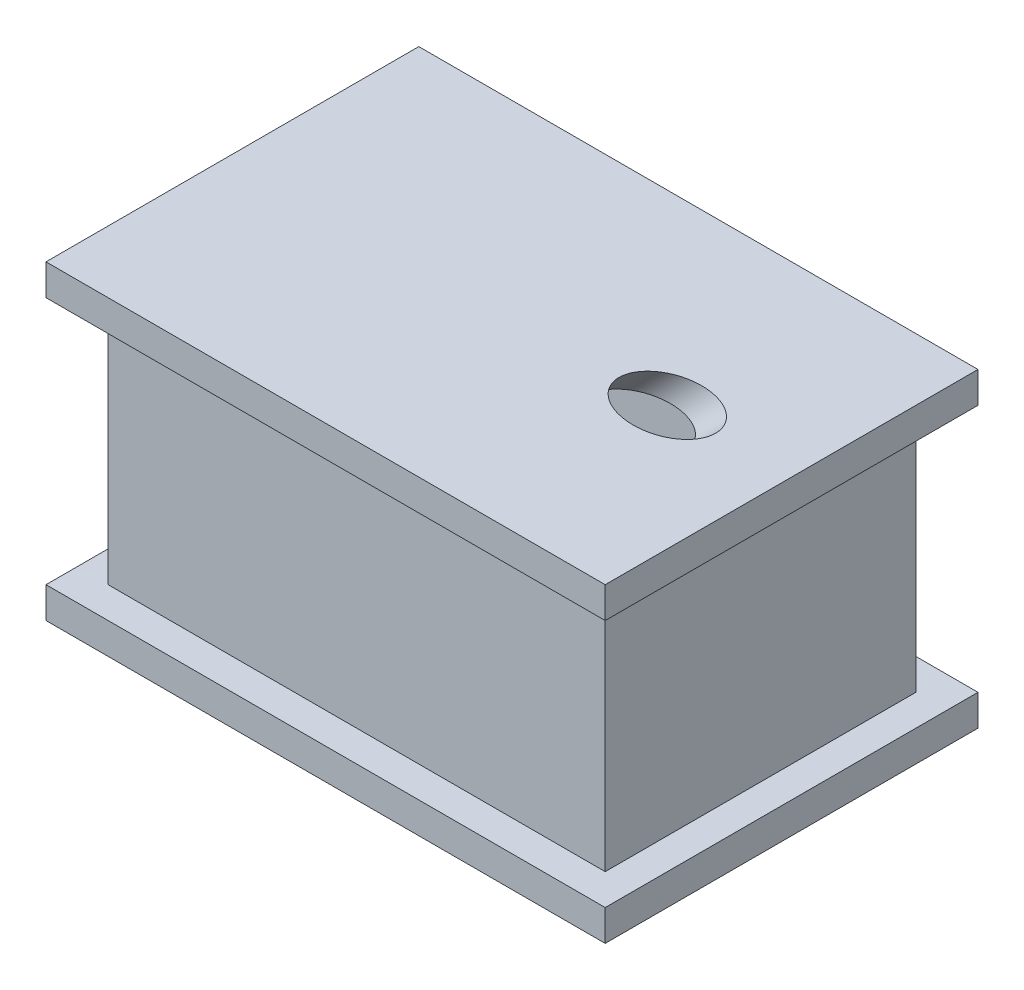
ISO-10303-21;
HEADER;
FILE_DESCRIPTION(('STEP AP214'),'2;1');
FILE_NAME('part.step','',(''),(''),'','','');
FILE_SCHEMA(('AUTOMOTIVE_DESIGN { 1 0 10303 214 1 1 1 1 }'));
ENDSEC;
DATA;
#1=APPLICATION_CONTEXT('core data for automotive mechanical design processes');
#2=APPLICATION_PROTOCOL_DEFINITION('international standard','automotive_design',2000,#1);
#3=PRODUCT_CONTEXT('',#1,'mechanical');
#4=PRODUCT('Part','Part','',(#3));
#5=PRODUCT_RELATED_PRODUCT_CATEGORY('part','',(#4));
#6=PRODUCT_DEFINITION_FORMATION('','',#4);
#7=PRODUCT_DEFINITION_CONTEXT('part definition',#1,'design');
#8=PRODUCT_DEFINITION('design','',#6,#7);
#9=PRODUCT_DEFINITION_SHAPE('','',#8);
#10=(LENGTH_UNIT() NAMED_UNIT(*) SI_UNIT(.MILLI.,.METRE.));
#11=(NAMED_UNIT(*) PLANE_ANGLE_UNIT() SI_UNIT($,.RADIAN.));
#12=(NAMED_UNIT(*) SI_UNIT($,.STERADIAN.) SOLID_ANGLE_UNIT());
#13=UNCERTAINTY_MEASURE_WITH_UNIT(LENGTH_MEASURE(1.E-05),#10,'distance_accuracy_value','');
#14=(GEOMETRIC_REPRESENTATION_CONTEXT(3) GLOBAL_UNCERTAINTY_ASSIGNED_CONTEXT((#13)) GLOBAL_UNIT_ASSIGNED_CONTEXT((#10,
#11,#12)) REPRESENTATION_CONTEXT('',''));
#15=CARTESIAN_POINT('',(0.,0.,0.));
#16=DIRECTION('',(0.,0.,1.));
#17=DIRECTION('',(1.,0.,0.));
#18=AXIS2_PLACEMENT_3D('',#15,#16,#17);
#19=CARTESIAN_POINT('',(-2000.,1000.,-1250.));
#20=DIRECTION('',(0.,0.,1.));
#21=DIRECTION('',(1.,0.,0.));
#22=AXIS2_PLACEMENT_3D('',#19,#20,#21);
#23=PLANE('',#22);
#24=DIRECTION('',(-1.,0.,0.));
#25=VECTOR('',#24,1.);
#26=CARTESIAN_POINT('',(-2000.,-1000.,-1250.));
#27=LINE('',#26,#25);
#28=CARTESIAN_POINT('',(2000.,-1000.,-1250.));
#29=VERTEX_POINT('',#28);
#30=CARTESIAN_POINT('',(-2000.,-1000.,-1250.));
#31=VERTEX_POINT('',#30);
#32=EDGE_CURVE('E266',#29,#31,#27,.T.);
#33=ORIENTED_EDGE('',*,*,#32,.T.);
#34=DIRECTION('',(0.,-1.,0.));
#35=VECTOR('',#34,1.);
#36=CARTESIAN_POINT('',(-2000.,1000.,-1250.));
#37=LINE('',#36,#35);
#38=CARTESIAN_POINT('',(-2000.,1000.,-1250.));
#39=VERTEX_POINT('',#38);
#40=EDGE_CURVE('E11',#39,#31,#37,.T.);
#41=ORIENTED_EDGE('',*,*,#40,.F.);
#42=DIRECTION('',(-1.,0.,0.));
#43=VECTOR('',#42,1.);
#44=CARTESIAN_POINT('',(-2000.,1000.,-1250.));
#45=LINE('',#44,#43);
#46=CARTESIAN_POINT('',(2000.,1000.,-1250.));
#47=VERTEX_POINT('',#46);
#48=EDGE_CURVE('E98',#47,#39,#45,.T.);
#49=ORIENTED_EDGE('',*,*,#48,.F.);
#50=DIRECTION('',(0.,-1.,0.));
#51=VECTOR('',#50,1.);
#52=CARTESIAN_POINT('',(2000.,1000.,-1250.));
#53=LINE('',#52,#51);
#54=EDGE_CURVE('E278',#47,#29,#53,.T.);
#55=ORIENTED_EDGE('',*,*,#54,.T.);
#56=EDGE_LOOP('',(#33,#41,#49,#55));
#57=FACE_BOUND('',#56,.T.);
#58=ADVANCED_FACE('F32',(#57),#23,.F.);
#59=CARTESIAN_POINT('',(-2000.,1000.,-1250.));
#60=DIRECTION('',(1.,0.,0.));
#61=DIRECTION('',(0.,0.,-1.));
#62=AXIS2_PLACEMENT_3D('',#59,#60,#61);
#63=PLANE('',#62);
#64=DIRECTION('',(0.,0.,1.));
#65=VECTOR('',#64,1.);
#66=CARTESIAN_POINT('',(-2000.,-1000.,-1250.));
#67=LINE('',#66,#65);
#68=CARTESIAN_POINT('',(-2000.,-1000.,1250.));
#69=VERTEX_POINT('',#68);
#70=EDGE_CURVE('E281',#31,#69,#67,.T.);
#71=ORIENTED_EDGE('',*,*,#70,.T.);
#72=DIRECTION('',(0.,-1.,0.));
#73=VECTOR('',#72,1.);
#74=CARTESIAN_POINT('',(-2000.,1000.,1250.));
#75=LINE('',#74,#73);
#76=CARTESIAN_POINT('',(-2000.,1000.,1250.));
#77=VERTEX_POINT('',#76);
#78=EDGE_CURVE('E40',#77,#69,#75,.T.);
#79=ORIENTED_EDGE('',*,*,#78,.F.);
#80=DIRECTION('',(0.,0.,1.));
#81=VECTOR('',#80,1.);
#82=CARTESIAN_POINT('',(-2000.,1000.,-1250.));
#83=LINE('',#82,#81);
#84=EDGE_CURVE('E268',#39,#77,#83,.T.);
#85=ORIENTED_EDGE('',*,*,#84,.F.);
#86=ORIENTED_EDGE('',*,*,#40,.T.);
#87=EDGE_LOOP('',(#71,#79,#85,#86));
#88=FACE_BOUND('',#87,.T.);
#89=ADVANCED_FACE('F291',(#88),#63,.F.);
#90=CARTESIAN_POINT('',(-2000.,1000.,1250.));
#91=DIRECTION('',(0.,0.,-1.));
#92=DIRECTION('',(-1.,0.,0.));
#93=AXIS2_PLACEMENT_3D('',#90,#91,#92);
#94=PLANE('',#93);
#95=DIRECTION('',(1.,0.,0.));
#96=VECTOR('',#95,1.);
#97=CARTESIAN_POINT('',(-2000.,-1000.,1250.));
#98=LINE('',#97,#96);
#99=CARTESIAN_POINT('',(2000.,-1000.,1250.));
#100=VERTEX_POINT('',#99);
#101=EDGE_CURVE('E68',#69,#100,#98,.T.);
#102=ORIENTED_EDGE('',*,*,#101,.T.);
#103=DIRECTION('',(0.,-1.,0.));
#104=VECTOR('',#103,1.);
#105=CARTESIAN_POINT('',(2000.,1000.,1250.));
#106=LINE('',#105,#104);
#107=CARTESIAN_POINT('',(2000.,1000.,1250.));
#108=VERTEX_POINT('',#107);
#109=EDGE_CURVE('E56',#108,#100,#106,.T.);
#110=ORIENTED_EDGE('',*,*,#109,.F.);
#111=DIRECTION('',(1.,0.,0.));
#112=VECTOR('',#111,1.);
#113=CARTESIAN_POINT('',(-2000.,1000.,1250.));
#114=LINE('',#113,#112);
#115=EDGE_CURVE('E272',#77,#108,#114,.T.);
#116=ORIENTED_EDGE('',*,*,#115,.F.);
#117=ORIENTED_EDGE('',*,*,#78,.T.);
#118=EDGE_LOOP('',(#102,#110,#116,#117));
#119=FACE_BOUND('',#118,.T.);
#120=ADVANCED_FACE('F289',(#119),#94,.F.);
#121=CARTESIAN_POINT('',(2000.,1000.,-1250.));
#122=DIRECTION('',(-1.,0.,0.));
#123=DIRECTION('',(0.,0.,1.));
#124=AXIS2_PLACEMENT_3D('',#121,#122,#123);
#125=PLANE('',#124);
#126=DIRECTION('',(0.,0.,-1.));
#127=VECTOR('',#126,1.);
#128=CARTESIAN_POINT('',(2000.,-1000.,-1250.));
#129=LINE('',#128,#127);
#130=EDGE_CURVE('E269',#100,#29,#129,.T.);
#131=ORIENTED_EDGE('',*,*,#130,.T.);
#132=ORIENTED_EDGE('',*,*,#54,.F.);
#133=DIRECTION('',(0.,0.,-1.));
#134=VECTOR('',#133,1.);
#135=CARTESIAN_POINT('',(2000.,1000.,-1250.));
#136=LINE('',#135,#134);
#137=EDGE_CURVE('E275',#108,#47,#136,.T.);
#138=ORIENTED_EDGE('',*,*,#137,.F.);
#139=ORIENTED_EDGE('',*,*,#109,.T.);
#140=EDGE_LOOP('',(#131,#132,#138,#139));
#141=FACE_BOUND('',#140,.T.);
#142=ADVANCED_FACE('F295',(#141),#125,.F.);
#143=CARTESIAN_POINT('',(0.,1000.,0.));
#144=DIRECTION('',(0.,1.,0.));
#145=DIRECTION('',(0.,0.,1.));
#146=AXIS2_PLACEMENT_3D('',#143,#144,#145);
#147=PLANE('',#146);
#148=DIRECTION('',(0.,0.,-1.));
#149=VECTOR('',#148,1.);
#150=CARTESIAN_POINT('',(2250.,1000.,1500.));
#151=LINE('',#150,#149);
#152=CARTESIAN_POINT('',(2250.,1000.,1500.));
#153=VERTEX_POINT('',#152);
#154=CARTESIAN_POINT('',(2250.,1000.,-1500.));
#155=VERTEX_POINT('',#154);
#156=EDGE_CURVE('E180',#153,#155,#151,.T.);
#157=ORIENTED_EDGE('',*,*,#156,.F.);
#158=DIRECTION('',(1.,0.,0.));
#159=VECTOR('',#158,1.);
#160=CARTESIAN_POINT('',(-2250.,1000.,1500.));
#161=LINE('',#160,#159);
#162=CARTESIAN_POINT('',(-2250.,1000.,1500.));
#163=VERTEX_POINT('',#162);
#164=EDGE_CURVE('E218',#163,#153,#161,.T.);
#165=ORIENTED_EDGE('',*,*,#164,.F.);
#166=DIRECTION('',(0.,0.,1.));
#167=VECTOR('',#166,1.);
#168=CARTESIAN_POINT('',(-2250.,1000.,-1500.));
#169=LINE('',#168,#167);
#170=CARTESIAN_POINT('',(-2250.,1000.,-1500.));
#171=VERTEX_POINT('',#170);
#172=EDGE_CURVE('E229',#171,#163,#169,.T.);
#173=ORIENTED_EDGE('',*,*,#172,.F.);
#174=DIRECTION('',(-1.,0.,0.));
#175=VECTOR('',#174,1.);
#176=CARTESIAN_POINT('',(2250.,1000.,-1500.));
#177=LINE('',#176,#175);
#178=EDGE_CURVE('E227',#155,#171,#177,.T.);
#179=ORIENTED_EDGE('',*,*,#178,.F.);
#180=EDGE_LOOP('',(#157,#165,#173,#179));
#181=FACE_BOUND('',#180,.T.);
#182=ORIENTED_EDGE('',*,*,#137,.T.);
#183=ORIENTED_EDGE('',*,*,#48,.T.);
#184=ORIENTED_EDGE('',*,*,#84,.T.);
#185=ORIENTED_EDGE('',*,*,#115,.T.);
#186=EDGE_LOOP('',(#182,#183,#184,#185));
#187=FACE_BOUND('',#186,.T.);
#188=ADVANCED_FACE('F307',(#181,#187),#147,.F.);
#189=CARTESIAN_POINT('',(2250.,1250.,1500.));
#190=DIRECTION('',(-1.,0.,0.));
#191=DIRECTION('',(0.,0.,1.));
#192=AXIS2_PLACEMENT_3D('',#189,#190,#191);
#193=PLANE('',#192);
#194=ORIENTED_EDGE('',*,*,#156,.T.);
#195=DIRECTION('',(0.,-1.,0.));
#196=VECTOR('',#195,1.);
#197=CARTESIAN_POINT('',(2250.,1250.,-1500.));
#198=LINE('',#197,#196);
#199=CARTESIAN_POINT('',(2250.,1250.,-1500.));
#200=VERTEX_POINT('',#199);
#201=EDGE_CURVE('E240',#200,#155,#198,.T.);
#202=ORIENTED_EDGE('',*,*,#201,.F.);
#203=DIRECTION('',(0.,0.,-1.));
#204=VECTOR('',#203,1.);
#205=CARTESIAN_POINT('',(2250.,1250.,1500.));
#206=LINE('',#205,#204);
#207=CARTESIAN_POINT('',(2250.,1250.,1500.));
#208=VERTEX_POINT('',#207);
#209=EDGE_CURVE('E214',#208,#200,#206,.T.);
#210=ORIENTED_EDGE('',*,*,#209,.F.);
#211=DIRECTION('',(0.,-1.,0.));
#212=VECTOR('',#211,1.);
#213=CARTESIAN_POINT('',(2250.,1250.,1500.));
#214=LINE('',#213,#212);
#215=EDGE_CURVE('E224',#208,#153,#214,.T.);
#216=ORIENTED_EDGE('',*,*,#215,.T.);
#217=EDGE_LOOP('',(#194,#202,#210,#216));
#218=FACE_BOUND('',#217,.T.);
#219=ADVANCED_FACE('F323',(#218),#193,.F.);
#220=CARTESIAN_POINT('',(2250.,1250.,-1500.));
#221=DIRECTION('',(0.,0.,1.));
#222=DIRECTION('',(1.,0.,0.));
#223=AXIS2_PLACEMENT_3D('',#220,#221,#222);
#224=PLANE('',#223);
#225=ORIENTED_EDGE('',*,*,#178,.T.);
#226=DIRECTION('',(0.,-1.,0.));
#227=VECTOR('',#226,1.);
#228=CARTESIAN_POINT('',(-2250.,1250.,-1500.));
#229=LINE('',#228,#227);
#230=CARTESIAN_POINT('',(-2250.,1250.,-1500.));
#231=VERTEX_POINT('',#230);
#232=EDGE_CURVE('E237',#231,#171,#229,.T.);
#233=ORIENTED_EDGE('',*,*,#232,.F.);
#234=DIRECTION('',(-1.,0.,0.));
#235=VECTOR('',#234,1.);
#236=CARTESIAN_POINT('',(2250.,1250.,-1500.));
#237=LINE('',#236,#235);
#238=EDGE_CURVE('E217',#200,#231,#237,.T.);
#239=ORIENTED_EDGE('',*,*,#238,.F.);
#240=ORIENTED_EDGE('',*,*,#201,.T.);
#241=EDGE_LOOP('',(#225,#233,#239,#240));
#242=FACE_BOUND('',#241,.T.);
#243=ADVANCED_FACE('F326',(#242),#224,.F.);
#244=CARTESIAN_POINT('',(-2250.,1250.,-1500.));
#245=DIRECTION('',(1.,0.,0.));
#246=DIRECTION('',(0.,0.,-1.));
#247=AXIS2_PLACEMENT_3D('',#244,#245,#246);
#248=PLANE('',#247);
#249=ORIENTED_EDGE('',*,*,#172,.T.);
#250=DIRECTION('',(0.,-1.,0.));
#251=VECTOR('',#250,1.);
#252=CARTESIAN_POINT('',(-2250.,1250.,1500.));
#253=LINE('',#252,#251);
#254=CARTESIAN_POINT('',(-2250.,1250.,1500.));
#255=VERTEX_POINT('',#254);
#256=EDGE_CURVE('E234',#255,#163,#253,.T.);
#257=ORIENTED_EDGE('',*,*,#256,.F.);
#258=DIRECTION('',(0.,0.,1.));
#259=VECTOR('',#258,1.);
#260=CARTESIAN_POINT('',(-2250.,1250.,-1500.));
#261=LINE('',#260,#259);
#262=EDGE_CURVE('E220',#231,#255,#261,.T.);
#263=ORIENTED_EDGE('',*,*,#262,.F.);
#264=ORIENTED_EDGE('',*,*,#232,.T.);
#265=EDGE_LOOP('',(#249,#257,#263,#264));
#266=FACE_BOUND('',#265,.T.);
#267=ADVANCED_FACE('F330',(#266),#248,.F.);
#268=CARTESIAN_POINT('',(-2250.,1250.,1500.));
#269=DIRECTION('',(0.,0.,-1.));
#270=DIRECTION('',(-1.,0.,0.));
#271=AXIS2_PLACEMENT_3D('',#268,#269,#270);
#272=PLANE('',#271);
#273=ORIENTED_EDGE('',*,*,#164,.T.);
#274=ORIENTED_EDGE('',*,*,#215,.F.);
#275=DIRECTION('',(1.,0.,0.));
#276=VECTOR('',#275,1.);
#277=CARTESIAN_POINT('',(-2250.,1250.,1500.));
#278=LINE('',#277,#276);
#279=EDGE_CURVE('E222',#255,#208,#278,.T.);
#280=ORIENTED_EDGE('',*,*,#279,.F.);
#281=ORIENTED_EDGE('',*,*,#256,.T.);
#282=EDGE_LOOP('',(#273,#274,#280,#281));
#283=FACE_BOUND('',#282,.T.);
#284=ADVANCED_FACE('F334',(#283),#272,.F.);
#285=CARTESIAN_POINT('',(0.,1250.,0.));
#286=DIRECTION('',(0.,1.,0.));
#287=DIRECTION('',(0.,0.,1.));
#288=AXIS2_PLACEMENT_3D('',#285,#286,#287);
#289=PLANE('',#288);
#290=CARTESIAN_POINT('',(1250.,1250.,0.));
#291=DIRECTION('',(0.,1.,0.));
#292=DIRECTION('',(-1.,0.,0.));
#293=AXIS2_PLACEMENT_3D('',#290,#291,#292);
#294=ELLIPSE('',#293,388.908729652601,275.);
#295=CARTESIAN_POINT('',(861.091270347398,1250.,0.));
#296=VERTEX_POINT('',#295);
#297=EDGE_CURVE('E203',#296,#296,#294,.F.);
#298=ORIENTED_EDGE('',*,*,#297,.T.);
#299=EDGE_LOOP('',(#298));
#300=FACE_BOUND('',#299,.T.);
#301=ORIENTED_EDGE('',*,*,#209,.T.);
#302=ORIENTED_EDGE('',*,*,#238,.T.);
#303=ORIENTED_EDGE('',*,*,#262,.T.);
#304=ORIENTED_EDGE('',*,*,#279,.T.);
#305=EDGE_LOOP('',(#301,#302,#303,#304));
#306=FACE_BOUND('',#305,.T.);
#307=ADVANCED_FACE('F338',(#300,#306),#289,.T.);
#308=CARTESIAN_POINT('',(2250.,-1250.,1500.));
#309=DIRECTION('',(1.,0.,0.));
#310=DIRECTION('',(0.,0.,-1.));
#311=AXIS2_PLACEMENT_3D('',#308,#309,#310);
#312=PLANE('',#311);
#313=DIRECTION('',(0.,0.,-1.));
#314=VECTOR('',#313,1.);
#315=CARTESIAN_POINT('',(2250.,-1000.,1500.));
#316=LINE('',#315,#314);
#317=CARTESIAN_POINT('',(2250.,-1000.,1500.));
#318=VERTEX_POINT('',#317);
#319=CARTESIAN_POINT('',(2250.,-1000.,-1500.));
#320=VERTEX_POINT('',#319);
#321=EDGE_CURVE('E175',#318,#320,#316,.T.);
#322=ORIENTED_EDGE('',*,*,#321,.F.);
#323=DIRECTION('',(0.,1.,0.));
#324=VECTOR('',#323,1.);
#325=CARTESIAN_POINT('',(2250.,-1250.,1500.));
#326=LINE('',#325,#324);
#327=CARTESIAN_POINT('',(2250.,-1250.,1500.));
#328=VERTEX_POINT('',#327);
#329=EDGE_CURVE('E169',#328,#318,#326,.T.);
#330=ORIENTED_EDGE('',*,*,#329,.F.);
#331=DIRECTION('',(0.,0.,-1.));
#332=VECTOR('',#331,1.);
#333=CARTESIAN_POINT('',(2250.,-1250.,1500.));
#334=LINE('',#333,#332);
#335=CARTESIAN_POINT('',(2250.,-1250.,-1500.));
#336=VERTEX_POINT('',#335);
#337=EDGE_CURVE('E172',#328,#336,#334,.T.);
#338=ORIENTED_EDGE('',*,*,#337,.T.);
#339=DIRECTION('',(0.,1.,0.));
#340=VECTOR('',#339,1.);
#341=CARTESIAN_POINT('',(2250.,-1250.,-1500.));
#342=LINE('',#341,#340);
#343=EDGE_CURVE('E200',#336,#320,#342,.T.);
#344=ORIENTED_EDGE('',*,*,#343,.T.);
#345=EDGE_LOOP('',(#322,#330,#338,#344));
#346=FACE_BOUND('',#345,.T.);
#347=ADVANCED_FACE('F171',(#346),#312,.T.);
#348=CARTESIAN_POINT('',(-2250.,-1250.,1500.));
#349=DIRECTION('',(0.,0.,1.));
#350=DIRECTION('',(1.,0.,0.));
#351=AXIS2_PLACEMENT_3D('',#348,#349,#350);
#352=PLANE('',#351);
#353=DIRECTION('',(1.,0.,0.));
#354=VECTOR('',#353,1.);
#355=CARTESIAN_POINT('',(-2250.,-1000.,1500.));
#356=LINE('',#355,#354);
#357=CARTESIAN_POINT('',(-2250.,-1000.,1500.));
#358=VERTEX_POINT('',#357);
#359=EDGE_CURVE('E202',#358,#318,#356,.T.);
#360=ORIENTED_EDGE('',*,*,#359,.F.);
#361=DIRECTION('',(0.,1.,0.));
#362=VECTOR('',#361,1.);
#363=CARTESIAN_POINT('',(-2250.,-1250.,1500.));
#364=LINE('',#363,#362);
#365=CARTESIAN_POINT('',(-2250.,-1250.,1500.));
#366=VERTEX_POINT('',#365);
#367=EDGE_CURVE('E181',#366,#358,#364,.T.);
#368=ORIENTED_EDGE('',*,*,#367,.F.);
#369=DIRECTION('',(1.,0.,0.));
#370=VECTOR('',#369,1.);
#371=CARTESIAN_POINT('',(-2250.,-1250.,1500.));
#372=LINE('',#371,#370);
#373=EDGE_CURVE('E187',#366,#328,#372,.T.);
#374=ORIENTED_EDGE('',*,*,#373,.T.);
#375=ORIENTED_EDGE('',*,*,#329,.T.);
#376=EDGE_LOOP('',(#360,#368,#374,#375));
#377=FACE_BOUND('',#376,.T.);
#378=ADVANCED_FACE('F193',(#377),#352,.T.);
#379=CARTESIAN_POINT('',(-2250.,-1250.,-1500.));
#380=DIRECTION('',(-1.,0.,0.));
#381=DIRECTION('',(0.,0.,1.));
#382=AXIS2_PLACEMENT_3D('',#379,#380,#381);
#383=PLANE('',#382);
#384=DIRECTION('',(0.,0.,1.));
#385=VECTOR('',#384,1.);
#386=CARTESIAN_POINT('',(-2250.,-1000.,-1500.));
#387=LINE('',#386,#385);
#388=CARTESIAN_POINT('',(-2250.,-1000.,-1500.));
#389=VERTEX_POINT('',#388);
#390=EDGE_CURVE('E205',#389,#358,#387,.T.);
#391=ORIENTED_EDGE('',*,*,#390,.F.);
#392=DIRECTION('',(0.,1.,0.));
#393=VECTOR('',#392,1.);
#394=CARTESIAN_POINT('',(-2250.,-1250.,-1500.));
#395=LINE('',#394,#393);
#396=CARTESIAN_POINT('',(-2250.,-1250.,-1500.));
#397=VERTEX_POINT('',#396);
#398=EDGE_CURVE('E211',#397,#389,#395,.T.);
#399=ORIENTED_EDGE('',*,*,#398,.F.);
#400=DIRECTION('',(0.,0.,1.));
#401=VECTOR('',#400,1.);
#402=CARTESIAN_POINT('',(-2250.,-1250.,-1500.));
#403=LINE('',#402,#401);
#404=EDGE_CURVE('E194',#397,#366,#403,.T.);
#405=ORIENTED_EDGE('',*,*,#404,.T.);
#406=ORIENTED_EDGE('',*,*,#367,.T.);
#407=EDGE_LOOP('',(#391,#399,#405,#406));
#408=FACE_BOUND('',#407,.T.);
#409=ADVANCED_FACE('F351',(#408),#383,.T.);
#410=CARTESIAN_POINT('',(2250.,-1250.,-1500.));
#411=DIRECTION('',(0.,0.,-1.));
#412=DIRECTION('',(-1.,0.,0.));
#413=AXIS2_PLACEMENT_3D('',#410,#411,#412);
#414=PLANE('',#413);
#415=DIRECTION('',(-1.,0.,0.));
#416=VECTOR('',#415,1.);
#417=CARTESIAN_POINT('',(2250.,-1000.,-1500.));
#418=LINE('',#417,#416);
#419=EDGE_CURVE('E191',#320,#389,#418,.T.);
#420=ORIENTED_EDGE('',*,*,#419,.F.);
#421=ORIENTED_EDGE('',*,*,#343,.F.);
#422=DIRECTION('',(-1.,0.,0.));
#423=VECTOR('',#422,1.);
#424=CARTESIAN_POINT('',(2250.,-1250.,-1500.));
#425=LINE('',#424,#423);
#426=EDGE_CURVE('E190',#336,#397,#425,.T.);
#427=ORIENTED_EDGE('',*,*,#426,.T.);
#428=ORIENTED_EDGE('',*,*,#398,.T.);
#429=EDGE_LOOP('',(#420,#421,#427,#428));
#430=FACE_BOUND('',#429,.T.);
#431=ADVANCED_FACE('F354',(#430),#414,.T.);
#432=CARTESIAN_POINT('',(0.,-1250.,0.));
#433=DIRECTION('',(0.,-1.,0.));
#434=DIRECTION('',(0.,0.,1.));
#435=AXIS2_PLACEMENT_3D('',#432,#433,#434);
#436=PLANE('',#435);
#437=ORIENTED_EDGE('',*,*,#337,.F.);
#438=ORIENTED_EDGE('',*,*,#373,.F.);
#439=ORIENTED_EDGE('',*,*,#404,.F.);
#440=ORIENTED_EDGE('',*,*,#426,.F.);
#441=EDGE_LOOP('',(#437,#438,#439,#440));
#442=FACE_BOUND('',#441,.T.);
#443=ADVANCED_FACE('F185',(#442),#436,.T.);
#444=CARTESIAN_POINT('',(0.,-1000.,0.));
#445=DIRECTION('',(0.,-1.,0.));
#446=DIRECTION('',(0.,0.,1.));
#447=AXIS2_PLACEMENT_3D('',#444,#445,#446);
#448=PLANE('',#447);
#449=ORIENTED_EDGE('',*,*,#32,.F.);
#450=ORIENTED_EDGE('',*,*,#130,.F.);
#451=ORIENTED_EDGE('',*,*,#101,.F.);
#452=ORIENTED_EDGE('',*,*,#70,.F.);
#453=EDGE_LOOP('',(#449,#450,#451,#452));
#454=FACE_BOUND('',#453,.T.);
#455=ORIENTED_EDGE('',*,*,#321,.T.);
#456=ORIENTED_EDGE('',*,*,#419,.T.);
#457=ORIENTED_EDGE('',*,*,#390,.T.);
#458=ORIENTED_EDGE('',*,*,#359,.T.);
#459=EDGE_LOOP('',(#455,#456,#457,#458));
#460=FACE_BOUND('',#459,.T.);
#461=ADVANCED_FACE('F292',(#454,#460),#448,.F.);
#462=CARTESIAN_POINT('',(1750.,1750.,0.));
#463=DIRECTION('',(-0.707106781186547,-0.707106781186548,0.));
#464=DIRECTION('',(0.707106781186548,-0.707106781186547,0.));
#465=AXIS2_PLACEMENT_3D('',#462,#463,#464);
#466=CYLINDRICAL_SURFACE('',#465,275.);
#467=ORIENTED_EDGE('',*,*,#297,.F.);
#468=EDGE_LOOP('',(#467));
#469=FACE_BOUND('',#468,.T.);
#470=CARTESIAN_POINT('',(999.999999999999,1000.,0.));
#471=DIRECTION('',(0.,1.,0.));
#472=DIRECTION('',(-1.,0.,0.));
#473=AXIS2_PLACEMENT_3D('',#470,#471,#472);
#474=ELLIPSE('',#473,388.908729652601,275.);
#475=CARTESIAN_POINT('',(611.091270347398,1000.,0.));
#476=VERTEX_POINT('',#475);
#477=EDGE_CURVE('E35',#476,#476,#474,.F.);
#478=ORIENTED_EDGE('',*,*,#477,.T.);
#479=EDGE_LOOP('',(#478));
#480=FACE_BOUND('',#479,.T.);
#481=ADVANCED_FACE('F361',(#469,#480),#466,.F.);
#482=DIRECTION('',(0.,0.,1.));
#483=VECTOR('',#482,1.);
#484=CARTESIAN_POINT('',(-1750.,-1000.,-1000.));
#485=LINE('',#484,#483);
#486=CARTESIAN_POINT('',(-1750.,-1000.,-1000.));
#487=VERTEX_POINT('',#486);
#488=CARTESIAN_POINT('',(-1750.,-1000.,1000.));
#489=VERTEX_POINT('',#488);
#490=EDGE_CURVE('E253',#487,#489,#485,.T.);
#491=ORIENTED_EDGE('',*,*,#490,.T.);
#492=DIRECTION('',(1.,0.,0.));
#493=VECTOR('',#492,1.);
#494=CARTESIAN_POINT('',(-1750.,-1000.,1000.));
#495=LINE('',#494,#493);
#496=CARTESIAN_POINT('',(1750.,-1000.,1000.));
#497=VERTEX_POINT('',#496);
#498=EDGE_CURVE('E245',#489,#497,#495,.T.);
#499=ORIENTED_EDGE('',*,*,#498,.T.);
#500=DIRECTION('',(0.,0.,-1.));
#501=VECTOR('',#500,1.);
#502=CARTESIAN_POINT('',(1750.,-1000.,-1000.));
#503=LINE('',#502,#501);
#504=CARTESIAN_POINT('',(1750.,-1000.,-1000.));
#505=VERTEX_POINT('',#504);
#506=EDGE_CURVE('E47',#497,#505,#503,.T.);
#507=ORIENTED_EDGE('',*,*,#506,.T.);
#508=DIRECTION('',(-1.,0.,0.));
#509=VECTOR('',#508,1.);
#510=CARTESIAN_POINT('',(-1750.,-1000.,-1000.));
#511=LINE('',#510,#509);
#512=EDGE_CURVE('E91',#505,#487,#511,.T.);
#513=ORIENTED_EDGE('',*,*,#512,.T.);
#514=EDGE_LOOP('',(#491,#499,#507,#513));
#515=FACE_BOUND('',#514,.T.);
#516=ADVANCED_FACE('F342',(#515),#448,.F.);
#517=ORIENTED_EDGE('',*,*,#477,.F.);
#518=EDGE_LOOP('',(#517));
#519=FACE_BOUND('',#518,.T.);
#520=DIRECTION('',(0.,0.,-1.));
#521=VECTOR('',#520,1.);
#522=CARTESIAN_POINT('',(1750.,1000.,-1000.));
#523=LINE('',#522,#521);
#524=CARTESIAN_POINT('',(1750.,1000.,1000.));
#525=VERTEX_POINT('',#524);
#526=CARTESIAN_POINT('',(1750.,1000.,-1000.));
#527=VERTEX_POINT('',#526);
#528=EDGE_CURVE('E103',#525,#527,#523,.T.);
#529=ORIENTED_EDGE('',*,*,#528,.F.);
#530=DIRECTION('',(1.,0.,0.));
#531=VECTOR('',#530,1.);
#532=CARTESIAN_POINT('',(-1750.,1000.,1000.));
#533=LINE('',#532,#531);
#534=CARTESIAN_POINT('',(-1750.,1000.,1000.));
#535=VERTEX_POINT('',#534);
#536=EDGE_CURVE('E248',#535,#525,#533,.T.);
#537=ORIENTED_EDGE('',*,*,#536,.F.);
#538=DIRECTION('',(0.,0.,1.));
#539=VECTOR('',#538,1.);
#540=CARTESIAN_POINT('',(-1750.,1000.,-1000.));
#541=LINE('',#540,#539);
#542=CARTESIAN_POINT('',(-1750.,1000.,-1000.));
#543=VERTEX_POINT('',#542);
#544=EDGE_CURVE('E78',#543,#535,#541,.T.);
#545=ORIENTED_EDGE('',*,*,#544,.F.);
#546=DIRECTION('',(-1.,0.,0.));
#547=VECTOR('',#546,1.);
#548=CARTESIAN_POINT('',(-1750.,1000.,-1000.));
#549=LINE('',#548,#547);
#550=EDGE_CURVE('E244',#527,#543,#549,.T.);
#551=ORIENTED_EDGE('',*,*,#550,.F.);
#552=EDGE_LOOP('',(#529,#537,#545,#551));
#553=FACE_BOUND('',#552,.T.);
#554=ADVANCED_FACE('F318',(#519,#553),#147,.F.);
#555=CARTESIAN_POINT('',(-1750.,1000.,-1000.));
#556=DIRECTION('',(1.,0.,0.));
#557=DIRECTION('',(0.,0.,-1.));
#558=AXIS2_PLACEMENT_3D('',#555,#556,#557);
#559=PLANE('',#558);
#560=ORIENTED_EDGE('',*,*,#490,.F.);
#561=DIRECTION('',(0.,-1.,0.));
#562=VECTOR('',#561,1.);
#563=CARTESIAN_POINT('',(-1750.,1000.,-1000.));
#564=LINE('',#563,#562);
#565=EDGE_CURVE('E262',#543,#487,#564,.T.);
#566=ORIENTED_EDGE('',*,*,#565,.F.);
#567=ORIENTED_EDGE('',*,*,#544,.T.);
#568=DIRECTION('',(0.,-1.,0.));
#569=VECTOR('',#568,1.);
#570=CARTESIAN_POINT('',(-1750.,1000.,1000.));
#571=LINE('',#570,#569);
#572=EDGE_CURVE('E259',#535,#489,#571,.T.);
#573=ORIENTED_EDGE('',*,*,#572,.T.);
#574=EDGE_LOOP('',(#560,#566,#567,#573));
#575=FACE_BOUND('',#574,.T.);
#576=ADVANCED_FACE('F315',(#575),#559,.T.);
#577=CARTESIAN_POINT('',(-1750.,1000.,-1000.));
#578=DIRECTION('',(0.,0.,1.));
#579=DIRECTION('',(1.,0.,0.));
#580=AXIS2_PLACEMENT_3D('',#577,#578,#579);
#581=PLANE('',#580);
#582=ORIENTED_EDGE('',*,*,#512,.F.);
#583=DIRECTION('',(0.,-1.,0.));
#584=VECTOR('',#583,1.);
#585=CARTESIAN_POINT('',(1750.,1000.,-1000.));
#586=LINE('',#585,#584);
#587=EDGE_CURVE('E264',#527,#505,#586,.T.);
#588=ORIENTED_EDGE('',*,*,#587,.F.);
#589=ORIENTED_EDGE('',*,*,#550,.T.);
#590=ORIENTED_EDGE('',*,*,#565,.T.);
#591=EDGE_LOOP('',(#582,#588,#589,#590));
#592=FACE_BOUND('',#591,.T.);
#593=ADVANCED_FACE('F312',(#592),#581,.T.);
#594=CARTESIAN_POINT('',(1750.,1000.,-1000.));
#595=DIRECTION('',(-1.,0.,0.));
#596=DIRECTION('',(0.,0.,1.));
#597=AXIS2_PLACEMENT_3D('',#594,#595,#596);
#598=PLANE('',#597);
#599=ORIENTED_EDGE('',*,*,#506,.F.);
#600=DIRECTION('',(0.,-1.,0.));
#601=VECTOR('',#600,1.);
#602=CARTESIAN_POINT('',(1750.,1000.,1000.));
#603=LINE('',#602,#601);
#604=EDGE_CURVE('E250',#525,#497,#603,.T.);
#605=ORIENTED_EDGE('',*,*,#604,.F.);
#606=ORIENTED_EDGE('',*,*,#528,.T.);
#607=ORIENTED_EDGE('',*,*,#587,.T.);
#608=EDGE_LOOP('',(#599,#605,#606,#607));
#609=FACE_BOUND('',#608,.T.);
#610=ADVANCED_FACE('F308',(#609),#598,.T.);
#611=CARTESIAN_POINT('',(-1750.,1000.,1000.));
#612=DIRECTION('',(0.,0.,-1.));
#613=DIRECTION('',(-1.,0.,0.));
#614=AXIS2_PLACEMENT_3D('',#611,#612,#613);
#615=PLANE('',#614);
#616=ORIENTED_EDGE('',*,*,#498,.F.);
#617=ORIENTED_EDGE('',*,*,#572,.F.);
#618=ORIENTED_EDGE('',*,*,#536,.T.);
#619=ORIENTED_EDGE('',*,*,#604,.T.);
#620=EDGE_LOOP('',(#616,#617,#618,#619));
#621=FACE_BOUND('',#620,.T.);
#622=ADVANCED_FACE('F311',(#621),#615,.T.);
#623=CLOSED_SHELL('',(#58,#89,#120,#142,#188,#219,#243,#267,#284,#307,#347,#378,#409,#431,#443,
#461,#481,#516,#554,#576,#593,#610,#622));
#624=MANIFOLD_SOLID_BREP('B2',#623);
#625=ADVANCED_BREP_SHAPE_REPRESENTATION('',(#18,#624),#14);
#626=SHAPE_DEFINITION_REPRESENTATION(#9,#625);
ENDSEC;
END-ISO-10303-21;
